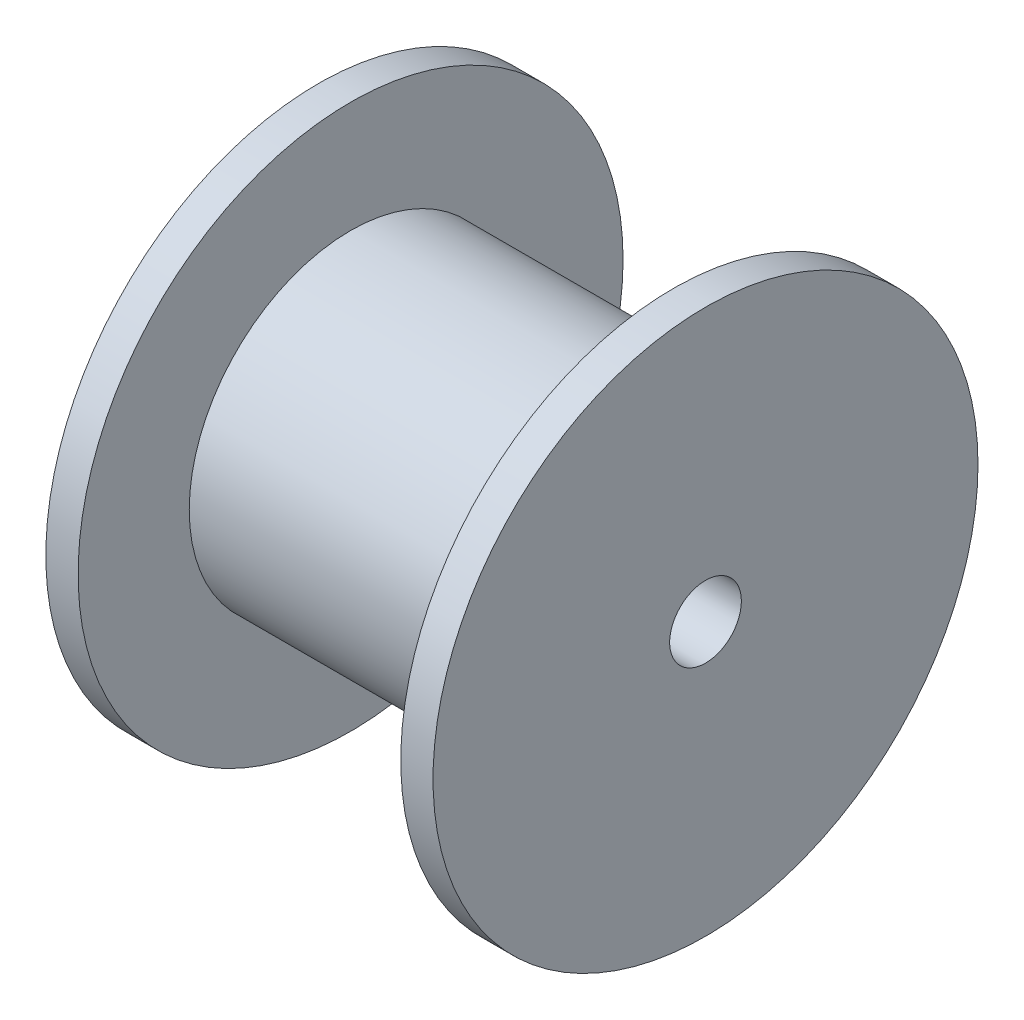
ISO-10303-21;
HEADER;
FILE_DESCRIPTION(('STEP AP214'),'2;1');
FILE_NAME('part.step','',(''),(''),'','','');
FILE_SCHEMA(('AUTOMOTIVE_DESIGN { 1 0 10303 214 1 1 1 1 }'));
ENDSEC;
DATA;
#1=APPLICATION_CONTEXT('core data for automotive mechanical design processes');
#2=APPLICATION_PROTOCOL_DEFINITION('international standard','automotive_design',2000,#1);
#3=PRODUCT_CONTEXT('',#1,'mechanical');
#4=PRODUCT('Part','Part','',(#3));
#5=PRODUCT_RELATED_PRODUCT_CATEGORY('part','',(#4));
#6=PRODUCT_DEFINITION_FORMATION('','',#4);
#7=PRODUCT_DEFINITION_CONTEXT('part definition',#1,'design');
#8=PRODUCT_DEFINITION('design','',#6,#7);
#9=PRODUCT_DEFINITION_SHAPE('','',#8);
#10=(LENGTH_UNIT() NAMED_UNIT(*) SI_UNIT(.MILLI.,.METRE.));
#11=(NAMED_UNIT(*) PLANE_ANGLE_UNIT() SI_UNIT($,.RADIAN.));
#12=(NAMED_UNIT(*) SI_UNIT($,.STERADIAN.) SOLID_ANGLE_UNIT());
#13=UNCERTAINTY_MEASURE_WITH_UNIT(LENGTH_MEASURE(1.E-05),#10,'distance_accuracy_value','');
#14=(GEOMETRIC_REPRESENTATION_CONTEXT(3) GLOBAL_UNCERTAINTY_ASSIGNED_CONTEXT((#13)) GLOBAL_UNIT_ASSIGNED_CONTEXT((#10,
#11,#12)) REPRESENTATION_CONTEXT('',''));
#15=CARTESIAN_POINT('',(0.,0.,0.));
#16=DIRECTION('',(0.,0.,1.));
#17=DIRECTION('',(1.,0.,0.));
#18=AXIS2_PLACEMENT_3D('',#15,#16,#17);
#19=CARTESIAN_POINT('',(9.,0.,0.));
#20=DIRECTION('',(1.,0.,0.));
#21=DIRECTION('',(0.,0.,-1.));
#22=AXIS2_PLACEMENT_3D('',#19,#20,#21);
#23=PLANE('',#22);
#24=CARTESIAN_POINT('',(9.,0.,0.));
#25=DIRECTION('',(1.,0.,0.));
#26=DIRECTION('',(0.,0.,-1.));
#27=AXIS2_PLACEMENT_3D('',#24,#25,#26);
#28=CIRCLE('',#27,76.);
#29=CARTESIAN_POINT('',(9.,0.,-76.));
#30=VERTEX_POINT('',#29);
#31=EDGE_CURVE('E10',#30,#30,#28,.T.);
#32=ORIENTED_EDGE('',*,*,#31,.T.);
#33=EDGE_LOOP('',(#32));
#34=FACE_BOUND('',#33,.T.);
#35=CARTESIAN_POINT('',(9.,0.,0.));
#36=DIRECTION('',(1.,0.,0.));
#37=DIRECTION('',(0.,0.,-1.));
#38=AXIS2_PLACEMENT_3D('',#35,#36,#37);
#39=CIRCLE('',#38,45.);
#40=CARTESIAN_POINT('',(9.00000000000001,0.,45.));
#41=VERTEX_POINT('',#40);
#42=EDGE_CURVE('E43',#41,#41,#39,.T.);
#43=ORIENTED_EDGE('',*,*,#42,.F.);
#44=EDGE_LOOP('',(#43));
#45=FACE_BOUND('',#44,.T.);
#46=ADVANCED_FACE('F30',(#34,#45),#23,.T.);
#47=CARTESIAN_POINT('',(9.,0.,0.));
#48=DIRECTION('',(-1.,0.,0.));
#49=DIRECTION('',(0.,0.,1.));
#50=AXIS2_PLACEMENT_3D('',#47,#48,#49);
#51=CYLINDRICAL_SURFACE('',#50,76.);
#52=ORIENTED_EDGE('',*,*,#31,.F.);
#53=EDGE_LOOP('',(#52));
#54=FACE_BOUND('',#53,.T.);
#55=CARTESIAN_POINT('',(0.,0.,0.));
#56=DIRECTION('',(1.,0.,0.));
#57=DIRECTION('',(0.,0.,-1.));
#58=AXIS2_PLACEMENT_3D('',#55,#56,#57);
#59=CIRCLE('',#58,76.);
#60=CARTESIAN_POINT('',(0.,0.,-76.));
#61=VERTEX_POINT('',#60);
#62=EDGE_CURVE('E34',#61,#61,#59,.T.);
#63=ORIENTED_EDGE('',*,*,#62,.T.);
#64=EDGE_LOOP('',(#63));
#65=FACE_BOUND('',#64,.T.);
#66=ADVANCED_FACE('F32',(#54,#65),#51,.T.);
#67=CARTESIAN_POINT('',(0.,0.,0.));
#68=DIRECTION('',(1.,0.,0.));
#69=DIRECTION('',(0.,0.,-1.));
#70=AXIS2_PLACEMENT_3D('',#67,#68,#69);
#71=PLANE('',#70);
#72=CARTESIAN_POINT('',(0.,0.,0.));
#73=DIRECTION('',(1.,0.,0.));
#74=DIRECTION('',(0.,0.,-1.));
#75=AXIS2_PLACEMENT_3D('',#72,#73,#74);
#76=CIRCLE('',#75,10.);
#77=CARTESIAN_POINT('',(0.,0.,-10.));
#78=VERTEX_POINT('',#77);
#79=EDGE_CURVE('E52',#78,#78,#76,.T.);
#80=ORIENTED_EDGE('',*,*,#79,.T.);
#81=EDGE_LOOP('',(#80));
#82=FACE_BOUND('',#81,.T.);
#83=ORIENTED_EDGE('',*,*,#62,.F.);
#84=EDGE_LOOP('',(#83));
#85=FACE_BOUND('',#84,.T.);
#86=ADVANCED_FACE('F61',(#82,#85),#71,.F.);
#87=CARTESIAN_POINT('',(99.,0.,0.));
#88=DIRECTION('',(-1.,0.,0.));
#89=DIRECTION('',(0.,0.,1.));
#90=AXIS2_PLACEMENT_3D('',#87,#88,#89);
#91=CYLINDRICAL_SURFACE('',#90,45.);
#92=CARTESIAN_POINT('',(99.,0.,0.));
#93=DIRECTION('',(1.,0.,0.));
#94=DIRECTION('',(0.,0.,-1.));
#95=AXIS2_PLACEMENT_3D('',#92,#93,#94);
#96=CIRCLE('',#95,45.);
#97=CARTESIAN_POINT('',(99.,0.,45.));
#98=VERTEX_POINT('',#97);
#99=EDGE_CURVE('E41',#98,#98,#96,.T.);
#100=CARTESIAN_POINT('',(99.,0.,45.));
#101=CARTESIAN_POINT('',(98.0625,0.,45.));
#102=CARTESIAN_POINT('',(97.125,0.,45.));
#103=CARTESIAN_POINT('',(95.25,0.,45.));
#104=CARTESIAN_POINT('',(94.3125,0.,45.));
#105=CARTESIAN_POINT('',(92.4375,0.,45.));
#106=CARTESIAN_POINT('',(91.5,0.,45.));
#107=CARTESIAN_POINT('',(89.625,0.,45.));
#108=CARTESIAN_POINT('',(88.6875,0.,45.));
#109=CARTESIAN_POINT('',(86.8125,0.,45.));
#110=CARTESIAN_POINT('',(85.875,0.,45.));
#111=CARTESIAN_POINT('',(84.,0.,45.));
#112=CARTESIAN_POINT('',(83.0625,0.,45.));
#113=CARTESIAN_POINT('',(81.1875,0.,45.));
#114=CARTESIAN_POINT('',(80.25,0.,45.));
#115=CARTESIAN_POINT('',(78.375,0.,45.));
#116=CARTESIAN_POINT('',(77.4375,0.,45.));
#117=CARTESIAN_POINT('',(75.5625,0.,45.));
#118=CARTESIAN_POINT('',(74.625,0.,45.));
#119=CARTESIAN_POINT('',(72.75,0.,45.));
#120=CARTESIAN_POINT('',(71.8125,0.,45.));
#121=CARTESIAN_POINT('',(69.9375,0.,45.));
#122=CARTESIAN_POINT('',(69.,0.,45.));
#123=CARTESIAN_POINT('',(67.125,0.,45.));
#124=CARTESIAN_POINT('',(66.1875,0.,45.));
#125=CARTESIAN_POINT('',(64.3125,0.,45.));
#126=CARTESIAN_POINT('',(63.375,0.,45.));
#127=CARTESIAN_POINT('',(61.5,0.,45.));
#128=CARTESIAN_POINT('',(60.5625,0.,45.));
#129=CARTESIAN_POINT('',(58.6875,0.,45.));
#130=CARTESIAN_POINT('',(57.75,0.,45.));
#131=CARTESIAN_POINT('',(55.875,0.,45.));
#132=CARTESIAN_POINT('',(54.9375,0.,45.));
#133=CARTESIAN_POINT('',(53.0625,0.,45.));
#134=CARTESIAN_POINT('',(52.125,0.,45.));
#135=CARTESIAN_POINT('',(50.25,0.,45.));
#136=CARTESIAN_POINT('',(49.3125,0.,45.));
#137=CARTESIAN_POINT('',(47.4375,0.,45.));
#138=CARTESIAN_POINT('',(46.5,0.,45.));
#139=CARTESIAN_POINT('',(44.625,0.,45.));
#140=CARTESIAN_POINT('',(43.6875,0.,45.));
#141=CARTESIAN_POINT('',(41.8125,0.,45.));
#142=CARTESIAN_POINT('',(40.875,0.,45.));
#143=CARTESIAN_POINT('',(39.,0.,45.));
#144=CARTESIAN_POINT('',(38.0625,0.,45.));
#145=CARTESIAN_POINT('',(36.1875,0.,45.));
#146=CARTESIAN_POINT('',(35.25,0.,45.));
#147=CARTESIAN_POINT('',(33.375,0.,45.));
#148=CARTESIAN_POINT('',(32.4375,0.,45.));
#149=CARTESIAN_POINT('',(30.5625,0.,45.));
#150=CARTESIAN_POINT('',(29.625,0.,45.));
#151=CARTESIAN_POINT('',(27.75,0.,45.));
#152=CARTESIAN_POINT('',(26.8125,0.,45.));
#153=CARTESIAN_POINT('',(24.9375,0.,45.));
#154=CARTESIAN_POINT('',(24.,0.,45.));
#155=CARTESIAN_POINT('',(22.125,0.,45.));
#156=CARTESIAN_POINT('',(21.1875,0.,45.));
#157=CARTESIAN_POINT('',(19.3125,0.,45.));
#158=CARTESIAN_POINT('',(18.375,0.,45.));
#159=CARTESIAN_POINT('',(16.5,0.,45.));
#160=CARTESIAN_POINT('',(15.5625,0.,45.));
#161=CARTESIAN_POINT('',(13.6875,0.,45.));
#162=CARTESIAN_POINT('',(12.75,0.,45.));
#163=CARTESIAN_POINT('',(10.875,0.,45.));
#164=CARTESIAN_POINT('',(9.93750000000001,0.,45.));
#165=CARTESIAN_POINT('',(9.00000000000001,0.,45.));
#166=B_SPLINE_CURVE_WITH_KNOTS('',3,(#100,#101,#102,#103,#104,#105,#106,#107,#108,#109,#110,
#111,#112,#113,#114,#115,#116,#117,#118,#119,#120,#121,#122,#123,#124,#125,#126,#127,#128,#129,
#130,#131,#132,#133,#134,#135,#136,#137,#138,#139,#140,#141,#142,#143,#144,#145,#146,#147,#148,
#149,#150,#151,#152,#153,#154,#155,#156,#157,#158,#159,#160,#161,#162,#163,#164,#165),
.UNSPECIFIED.,.F.,.F.,(4,2,2,2,2,2,2,2,2,2,2,2,2,2,2,2,2,2,2,2,2,2,2,2,2,2,2,2,2,2,2,2,4),(0.,
2.81250000000001,5.62500000000001,8.4375,11.25,14.0625,16.875,19.6875,22.5,25.3125,28.125,
30.9375,33.75,36.5625,39.375,42.1875,45.,47.8125,50.625,53.4375,56.25,59.0625,61.875,64.6875,
67.5,70.3125,73.125,75.9375,78.75,81.5625,84.375,87.1875,90.),.UNSPECIFIED.);
#167=EDGE_CURVE('BSEAM85',#98,#41,#166,.T.);
#168=ORIENTED_EDGE('',*,*,#99,.F.);
#169=ORIENTED_EDGE('',*,*,#42,.T.);
#170=ORIENTED_EDGE('',*,*,#167,.T.);
#171=ORIENTED_EDGE('',*,*,#167,.F.);
#172=EDGE_LOOP('',(#168,#170,#169,#171));
#173=FACE_BOUND('',#172,.T.);
#174=ADVANCED_FACE('F85',(#173),#91,.T.);
#175=CARTESIAN_POINT('',(99.,0.,0.));
#176=DIRECTION('',(1.,0.,0.));
#177=DIRECTION('',(0.,0.,-1.));
#178=AXIS2_PLACEMENT_3D('',#175,#176,#177);
#179=PLANE('',#178);
#180=CARTESIAN_POINT('',(99.,0.,0.));
#181=DIRECTION('',(1.,0.,0.));
#182=DIRECTION('',(0.,0.,-1.));
#183=AXIS2_PLACEMENT_3D('',#180,#181,#182);
#184=CIRCLE('',#183,76.);
#185=CARTESIAN_POINT('',(99.,0.,-76.));
#186=VERTEX_POINT('',#185);
#187=EDGE_CURVE('E49',#186,#186,#184,.T.);
#188=ORIENTED_EDGE('',*,*,#187,.F.);
#189=EDGE_LOOP('',(#188));
#190=FACE_BOUND('',#189,.T.);
#191=ORIENTED_EDGE('',*,*,#99,.T.);
#192=EDGE_LOOP('',(#191));
#193=FACE_BOUND('',#192,.T.);
#194=ADVANCED_FACE('F79',(#190,#193),#179,.F.);
#195=CARTESIAN_POINT('',(108.,0.,0.));
#196=DIRECTION('',(-1.,0.,0.));
#197=DIRECTION('',(0.,0.,1.));
#198=AXIS2_PLACEMENT_3D('',#195,#196,#197);
#199=CYLINDRICAL_SURFACE('',#198,76.);
#200=CARTESIAN_POINT('',(108.,0.,0.));
#201=DIRECTION('',(1.,0.,0.));
#202=DIRECTION('',(0.,0.,-1.));
#203=AXIS2_PLACEMENT_3D('',#200,#201,#202);
#204=CIRCLE('',#203,76.);
#205=CARTESIAN_POINT('',(108.,0.,-76.));
#206=VERTEX_POINT('',#205);
#207=EDGE_CURVE('E46',#206,#206,#204,.T.);
#208=ORIENTED_EDGE('',*,*,#207,.F.);
#209=EDGE_LOOP('',(#208));
#210=FACE_BOUND('',#209,.T.);
#211=ORIENTED_EDGE('',*,*,#187,.T.);
#212=EDGE_LOOP('',(#211));
#213=FACE_BOUND('',#212,.T.);
#214=ADVANCED_FACE('F73',(#210,#213),#199,.T.);
#215=CARTESIAN_POINT('',(108.,0.,0.));
#216=DIRECTION('',(1.,0.,0.));
#217=DIRECTION('',(0.,0.,-1.));
#218=AXIS2_PLACEMENT_3D('',#215,#216,#217);
#219=PLANE('',#218);
#220=CARTESIAN_POINT('',(108.,0.,0.));
#221=DIRECTION('',(1.,0.,0.));
#222=DIRECTION('',(0.,0.,-1.));
#223=AXIS2_PLACEMENT_3D('',#220,#221,#222);
#224=CIRCLE('',#223,10.);
#225=CARTESIAN_POINT('',(108.,0.,-10.));
#226=VERTEX_POINT('',#225);
#227=EDGE_CURVE('E55',#226,#226,#224,.T.);
#228=ORIENTED_EDGE('',*,*,#227,.F.);
#229=EDGE_LOOP('',(#228));
#230=FACE_BOUND('',#229,.T.);
#231=ORIENTED_EDGE('',*,*,#207,.T.);
#232=EDGE_LOOP('',(#231));
#233=FACE_BOUND('',#232,.T.);
#234=ADVANCED_FACE('F67',(#230,#233),#219,.T.);
#235=CARTESIAN_POINT('',(0.,0.,0.));
#236=DIRECTION('',(1.,0.,0.));
#237=DIRECTION('',(0.,0.,-1.));
#238=AXIS2_PLACEMENT_3D('',#235,#236,#237);
#239=CYLINDRICAL_SURFACE('',#238,10.);
#240=ORIENTED_EDGE('',*,*,#79,.F.);
#241=EDGE_LOOP('',(#240));
#242=FACE_BOUND('',#241,.T.);
#243=ORIENTED_EDGE('',*,*,#227,.T.);
#244=EDGE_LOOP('',(#243));
#245=FACE_BOUND('',#244,.T.);
#246=ADVANCED_FACE('F64',(#242,#245),#239,.F.);
#247=CLOSED_SHELL('',(#46,#66,#86,#174,#194,#214,#234,#246));
#248=MANIFOLD_SOLID_BREP('B2',#247);
#249=ADVANCED_BREP_SHAPE_REPRESENTATION('',(#18,#248),#14);
#250=SHAPE_DEFINITION_REPRESENTATION(#9,#249);
ENDSEC;
END-ISO-10303-21;
